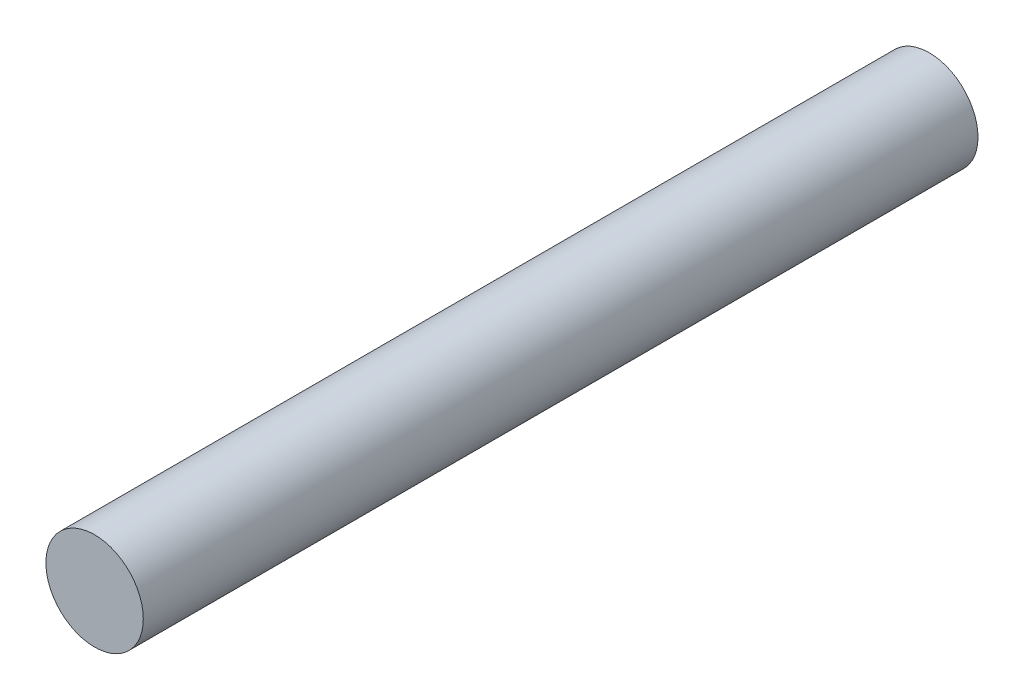
ISO-10303-21;
HEADER;
FILE_DESCRIPTION(('STEP AP214'),'2;1');
FILE_NAME('part.step','',(''),(''),'','','');
FILE_SCHEMA(('AUTOMOTIVE_DESIGN { 1 0 10303 214 1 1 1 1 }'));
ENDSEC;
DATA;
#1=APPLICATION_CONTEXT('core data for automotive mechanical design processes');
#2=APPLICATION_PROTOCOL_DEFINITION('international standard','automotive_design',2000,#1);
#3=PRODUCT_CONTEXT('',#1,'mechanical');
#4=PRODUCT('Part','Part','',(#3));
#5=PRODUCT_RELATED_PRODUCT_CATEGORY('part','',(#4));
#6=PRODUCT_DEFINITION_FORMATION('','',#4);
#7=PRODUCT_DEFINITION_CONTEXT('part definition',#1,'design');
#8=PRODUCT_DEFINITION('design','',#6,#7);
#9=PRODUCT_DEFINITION_SHAPE('','',#8);
#10=(LENGTH_UNIT() NAMED_UNIT(*) SI_UNIT(.MILLI.,.METRE.));
#11=(NAMED_UNIT(*) PLANE_ANGLE_UNIT() SI_UNIT($,.RADIAN.));
#12=(NAMED_UNIT(*) SI_UNIT($,.STERADIAN.) SOLID_ANGLE_UNIT());
#13=UNCERTAINTY_MEASURE_WITH_UNIT(LENGTH_MEASURE(1.E-05),#10,'distance_accuracy_value','');
#14=(GEOMETRIC_REPRESENTATION_CONTEXT(3) GLOBAL_UNCERTAINTY_ASSIGNED_CONTEXT((#13)) GLOBAL_UNIT_ASSIGNED_CONTEXT((#10,
#11,#12)) REPRESENTATION_CONTEXT('',''));
#15=CARTESIAN_POINT('',(0.,0.,0.));
#16=DIRECTION('',(0.,0.,1.));
#17=DIRECTION('',(1.,0.,0.));
#18=AXIS2_PLACEMENT_3D('',#15,#16,#17);
#19=CARTESIAN_POINT('',(0.,0.,30.));
#20=DIRECTION('',(0.,0.,-1.));
#21=DIRECTION('',(-1.,0.,0.));
#22=AXIS2_PLACEMENT_3D('',#19,#20,#21);
#23=CYLINDRICAL_SURFACE('',#22,3.5);
#24=CARTESIAN_POINT('',(0.,0.,30.));
#25=DIRECTION('',(0.,0.,1.));
#26=DIRECTION('',(1.,0.,0.));
#27=AXIS2_PLACEMENT_3D('',#24,#25,#26);
#28=CIRCLE('',#27,3.5);
#29=CARTESIAN_POINT('',(3.5,0.,30.));
#30=VERTEX_POINT('',#29);
#31=EDGE_CURVE('E10',#30,#30,#28,.T.);
#32=ORIENTED_EDGE('',*,*,#31,.F.);
#33=EDGE_LOOP('',(#32));
#34=FACE_BOUND('',#33,.T.);
#35=CARTESIAN_POINT('',(0.,0.,-30.));
#36=DIRECTION('',(0.,0.,1.));
#37=DIRECTION('',(1.,0.,0.));
#38=AXIS2_PLACEMENT_3D('',#35,#36,#37);
#39=CIRCLE('',#38,3.5);
#40=CARTESIAN_POINT('',(3.5,0.,-30.));
#41=VERTEX_POINT('',#40);
#42=EDGE_CURVE('E34',#41,#41,#39,.T.);
#43=ORIENTED_EDGE('',*,*,#42,.T.);
#44=EDGE_LOOP('',(#43));
#45=FACE_BOUND('',#44,.T.);
#46=ADVANCED_FACE('F31',(#34,#45),#23,.T.);
#47=CARTESIAN_POINT('',(0.,0.,30.));
#48=DIRECTION('',(0.,0.,1.));
#49=DIRECTION('',(1.,0.,0.));
#50=AXIS2_PLACEMENT_3D('',#47,#48,#49);
#51=PLANE('',#50);
#52=ORIENTED_EDGE('',*,*,#31,.T.);
#53=EDGE_LOOP('',(#52));
#54=FACE_BOUND('',#53,.T.);
#55=ADVANCED_FACE('F46',(#54),#51,.T.);
#56=CARTESIAN_POINT('',(0.,0.,-30.));
#57=DIRECTION('',(0.,0.,1.));
#58=DIRECTION('',(1.,0.,0.));
#59=AXIS2_PLACEMENT_3D('',#56,#57,#58);
#60=PLANE('',#59);
#61=ORIENTED_EDGE('',*,*,#42,.F.);
#62=EDGE_LOOP('',(#61));
#63=FACE_BOUND('',#62,.T.);
#64=ADVANCED_FACE('F44',(#63),#60,.F.);
#65=CLOSED_SHELL('',(#46,#55,#64));
#66=MANIFOLD_SOLID_BREP('B2',#65);
#67=ADVANCED_BREP_SHAPE_REPRESENTATION('',(#18,#66),#14);
#68=SHAPE_DEFINITION_REPRESENTATION(#9,#67);
ENDSEC;
END-ISO-10303-21;
